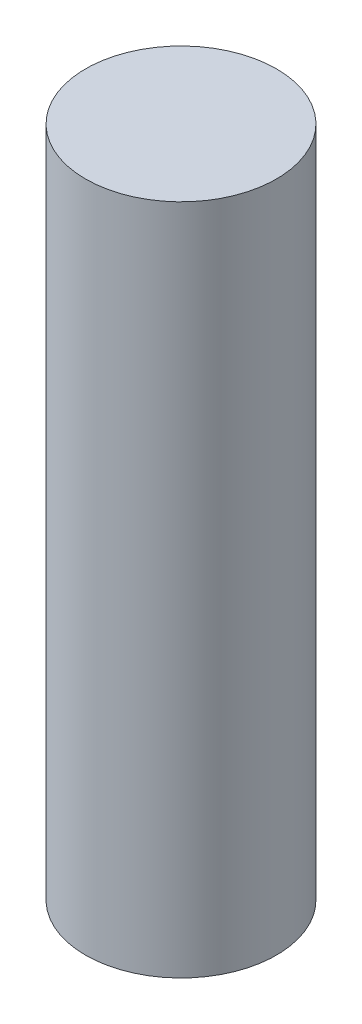
ISO-10303-21;
HEADER;
FILE_DESCRIPTION(('STEP AP214'),'2;1');
FILE_NAME('part.step','',(''),(''),'','','');
FILE_SCHEMA(('AUTOMOTIVE_DESIGN { 1 0 10303 214 1 1 1 1 }'));
ENDSEC;
DATA;
#1=APPLICATION_CONTEXT('core data for automotive mechanical design processes');
#2=APPLICATION_PROTOCOL_DEFINITION('international standard','automotive_design',2000,#1);
#3=PRODUCT_CONTEXT('',#1,'mechanical');
#4=PRODUCT('Part','Part','',(#3));
#5=PRODUCT_RELATED_PRODUCT_CATEGORY('part','',(#4));
#6=PRODUCT_DEFINITION_FORMATION('','',#4);
#7=PRODUCT_DEFINITION_CONTEXT('part definition',#1,'design');
#8=PRODUCT_DEFINITION('design','',#6,#7);
#9=PRODUCT_DEFINITION_SHAPE('','',#8);
#10=(LENGTH_UNIT() NAMED_UNIT(*) SI_UNIT(.MILLI.,.METRE.));
#11=(NAMED_UNIT(*) PLANE_ANGLE_UNIT() SI_UNIT($,.RADIAN.));
#12=(NAMED_UNIT(*) SI_UNIT($,.STERADIAN.) SOLID_ANGLE_UNIT());
#13=UNCERTAINTY_MEASURE_WITH_UNIT(LENGTH_MEASURE(1.E-05),#10,'distance_accuracy_value','');
#14=(GEOMETRIC_REPRESENTATION_CONTEXT(3) GLOBAL_UNCERTAINTY_ASSIGNED_CONTEXT((#13)) GLOBAL_UNIT_ASSIGNED_CONTEXT((#10,
#11,#12)) REPRESENTATION_CONTEXT('',''));
#15=CARTESIAN_POINT('',(0.,0.,0.));
#16=DIRECTION('',(0.,0.,1.));
#17=DIRECTION('',(1.,0.,0.));
#18=AXIS2_PLACEMENT_3D('',#15,#16,#17);
#19=CARTESIAN_POINT('',(0.,50.,0.));
#20=DIRECTION('',(0.,-1.,0.));
#21=DIRECTION('',(0.,0.,-1.));
#22=AXIS2_PLACEMENT_3D('',#19,#20,#21);
#23=CYLINDRICAL_SURFACE('',#22,7.1);
#24=CARTESIAN_POINT('',(0.,50.,0.));
#25=DIRECTION('',(0.,1.,0.));
#26=DIRECTION('',(0.,0.,1.));
#27=AXIS2_PLACEMENT_3D('',#24,#25,#26);
#28=CIRCLE('',#27,7.1);
#29=CARTESIAN_POINT('',(0.,50.,7.1));
#30=VERTEX_POINT('',#29);
#31=EDGE_CURVE('E10',#30,#30,#28,.T.);
#32=ORIENTED_EDGE('',*,*,#31,.F.);
#33=EDGE_LOOP('',(#32));
#34=FACE_BOUND('',#33,.T.);
#35=CARTESIAN_POINT('',(0.,0.,0.));
#36=DIRECTION('',(0.,1.,0.));
#37=DIRECTION('',(0.,0.,1.));
#38=AXIS2_PLACEMENT_3D('',#35,#36,#37);
#39=CIRCLE('',#38,7.1);
#40=CARTESIAN_POINT('',(0.,0.,7.1));
#41=VERTEX_POINT('',#40);
#42=EDGE_CURVE('E42',#41,#41,#39,.T.);
#43=ORIENTED_EDGE('',*,*,#42,.T.);
#44=EDGE_LOOP('',(#43));
#45=FACE_BOUND('',#44,.T.);
#46=ADVANCED_FACE('F39',(#34,#45),#23,.T.);
#47=CARTESIAN_POINT('',(0.,50.,0.));
#48=DIRECTION('',(0.,1.,0.));
#49=DIRECTION('',(0.,0.,1.));
#50=AXIS2_PLACEMENT_3D('',#47,#48,#49);
#51=PLANE('',#50);
#52=ORIENTED_EDGE('',*,*,#31,.T.);
#53=EDGE_LOOP('',(#52));
#54=FACE_BOUND('',#53,.T.);
#55=ADVANCED_FACE('F56',(#54),#51,.T.);
#56=CARTESIAN_POINT('',(0.,0.,0.));
#57=DIRECTION('',(0.,1.,0.));
#58=DIRECTION('',(0.,0.,1.));
#59=AXIS2_PLACEMENT_3D('',#56,#57,#58);
#60=PLANE('',#59);
#61=ORIENTED_EDGE('',*,*,#42,.F.);
#62=EDGE_LOOP('',(#61));
#63=FACE_BOUND('',#62,.T.);
#64=ADVANCED_FACE('F54',(#63),#60,.F.);
#65=CLOSED_SHELL('',(#46,#55,#64));
#66=MANIFOLD_SOLID_BREP('B2',#65);
#67=ADVANCED_BREP_SHAPE_REPRESENTATION('',(#18,#66),#14);
#68=SHAPE_DEFINITION_REPRESENTATION(#9,#67);
ENDSEC;
END-ISO-10303-21;
